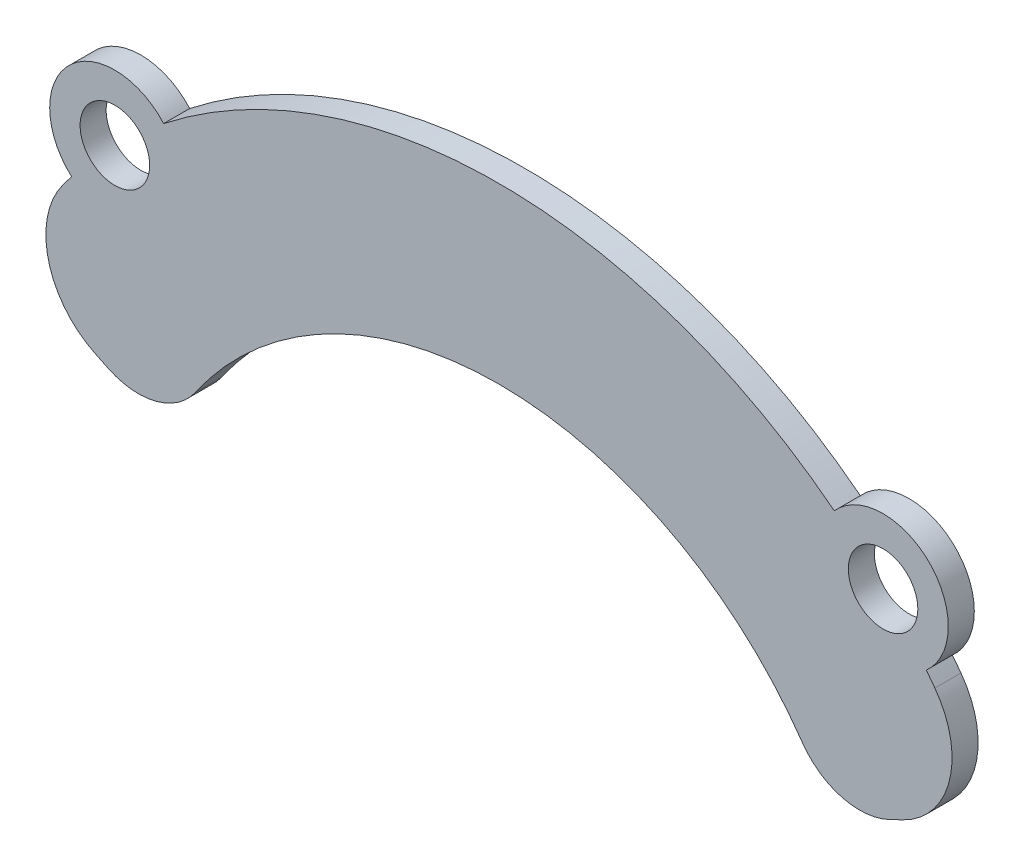
ISO-10303-21;
HEADER;
FILE_DESCRIPTION(('STEP AP214'),'2;1');
FILE_NAME('part.step','',(''),(''),'','','');
FILE_SCHEMA(('AUTOMOTIVE_DESIGN { 1 0 10303 214 1 1 1 1 }'));
ENDSEC;
DATA;
#1=APPLICATION_CONTEXT('core data for automotive mechanical design processes');
#2=APPLICATION_PROTOCOL_DEFINITION('international standard','automotive_design',2000,#1);
#3=PRODUCT_CONTEXT('',#1,'mechanical');
#4=PRODUCT('Part','Part','',(#3));
#5=PRODUCT_RELATED_PRODUCT_CATEGORY('part','',(#4));
#6=PRODUCT_DEFINITION_FORMATION('','',#4);
#7=PRODUCT_DEFINITION_CONTEXT('part definition',#1,'design');
#8=PRODUCT_DEFINITION('design','',#6,#7);
#9=PRODUCT_DEFINITION_SHAPE('','',#8);
#10=(LENGTH_UNIT() NAMED_UNIT(*) SI_UNIT(.MILLI.,.METRE.));
#11=(NAMED_UNIT(*) PLANE_ANGLE_UNIT() SI_UNIT($,.RADIAN.));
#12=(NAMED_UNIT(*) SI_UNIT($,.STERADIAN.) SOLID_ANGLE_UNIT());
#13=UNCERTAINTY_MEASURE_WITH_UNIT(LENGTH_MEASURE(1.E-05),#10,'distance_accuracy_value','');
#14=(GEOMETRIC_REPRESENTATION_CONTEXT(3) GLOBAL_UNCERTAINTY_ASSIGNED_CONTEXT((#13)) GLOBAL_UNIT_ASSIGNED_CONTEXT((#10,
#11,#12)) REPRESENTATION_CONTEXT('',''));
#15=CARTESIAN_POINT('',(0.,0.,0.));
#16=DIRECTION('',(0.,0.,1.));
#17=DIRECTION('',(1.,0.,0.));
#18=AXIS2_PLACEMENT_3D('',#15,#16,#17);
#19=CARTESIAN_POINT('',(0.,-86.8257001430602,6.));
#20=DIRECTION('',(0.,0.,-1.));
#21=DIRECTION('',(-1.,0.,0.));
#22=AXIS2_PLACEMENT_3D('',#19,#20,#21);
#23=CYLINDRICAL_SURFACE('',#22,187.5);
#24=CARTESIAN_POINT('',(0.,-86.8257001430602,-3.));
#25=DIRECTION('',(0.,0.,1.));
#26=DIRECTION('',(1.,0.,0.));
#27=AXIS2_PLACEMENT_3D('',#24,#25,#26);
#28=CIRCLE('',#27,187.5);
#29=CARTESIAN_POINT('',(115.746688386356,60.683466106335,-3.));
#30=VERTEX_POINT('',#29);
#31=CARTESIAN_POINT('',(-115.746688386356,60.683466106335,-3.));
#32=VERTEX_POINT('',#31);
#33=EDGE_CURVE('E167',#30,#32,#28,.T.);
#34=ORIENTED_EDGE('',*,*,#33,.T.);
#35=DIRECTION('',(0.,0.,-1.));
#36=VECTOR('',#35,1.);
#37=CARTESIAN_POINT('',(-115.746688386356,60.683466106335,6.));
#38=LINE('',#37,#36);
#39=CARTESIAN_POINT('',(-115.746688386356,60.683466106335,6.));
#40=VERTEX_POINT('',#39);
#41=EDGE_CURVE('E11',#40,#32,#38,.T.);
#42=ORIENTED_EDGE('',*,*,#41,.F.);
#43=CARTESIAN_POINT('',(0.,-86.8257001430602,6.));
#44=DIRECTION('',(0.,0.,1.));
#45=DIRECTION('',(1.,0.,0.));
#46=AXIS2_PLACEMENT_3D('',#43,#44,#45);
#47=CIRCLE('',#46,187.5);
#48=CARTESIAN_POINT('',(115.746688386356,60.683466106335,6.));
#49=VERTEX_POINT('',#48);
#50=EDGE_CURVE('E114',#49,#40,#47,.T.);
#51=ORIENTED_EDGE('',*,*,#50,.F.);
#52=DIRECTION('',(0.,0.,-1.));
#53=VECTOR('',#52,1.);
#54=CARTESIAN_POINT('',(115.746688386356,60.683466106335,6.));
#55=LINE('',#54,#53);
#56=EDGE_CURVE('E166',#49,#30,#55,.T.);
#57=ORIENTED_EDGE('',*,*,#56,.T.);
#58=EDGE_LOOP('',(#34,#42,#51,#57));
#59=FACE_BOUND('',#58,.T.);
#60=ADVANCED_FACE('F46',(#59),#23,.T.);
#61=CARTESIAN_POINT('',(-132.582521472477,45.7568213294177,6.));
#62=DIRECTION('',(0.,0.,-1.));
#63=DIRECTION('',(-1.,0.,0.));
#64=AXIS2_PLACEMENT_3D('',#61,#62,#63);
#65=CYLINDRICAL_SURFACE('',#64,22.5);
#66=CARTESIAN_POINT('',(-132.582521472477,45.7568213294177,-3.));
#67=DIRECTION('',(0.,0.,1.));
#68=DIRECTION('',(1.,0.,0.));
#69=AXIS2_PLACEMENT_3D('',#66,#67,#68);
#70=CIRCLE('',#69,22.5);
#71=CARTESIAN_POINT('',(-147.509166249395,28.9209882432968,-3.));
#72=VERTEX_POINT('',#71);
#73=EDGE_CURVE('E170',#72,#32,#70,.F.);
#74=ORIENTED_EDGE('',*,*,#73,.F.);
#75=DIRECTION('',(0.,0.,-1.));
#76=VECTOR('',#75,1.);
#77=CARTESIAN_POINT('',(-147.509166249395,28.9209882432968,6.));
#78=LINE('',#77,#76);
#79=CARTESIAN_POINT('',(-147.509166249395,28.9209882432968,6.));
#80=VERTEX_POINT('',#79);
#81=EDGE_CURVE('E55',#80,#72,#78,.T.);
#82=ORIENTED_EDGE('',*,*,#81,.F.);
#83=CARTESIAN_POINT('',(-132.582521472477,45.7568213294177,6.));
#84=DIRECTION('',(0.,0.,1.));
#85=DIRECTION('',(1.,0.,0.));
#86=AXIS2_PLACEMENT_3D('',#83,#84,#85);
#87=CIRCLE('',#86,22.5);
#88=EDGE_CURVE('E225',#80,#40,#87,.F.);
#89=ORIENTED_EDGE('',*,*,#88,.T.);
#90=ORIENTED_EDGE('',*,*,#41,.T.);
#91=EDGE_LOOP('',(#74,#82,#89,#90));
#92=FACE_BOUND('',#91,.T.);
#93=ADVANCED_FACE('F48',(#92),#65,.T.);
#94=CARTESIAN_POINT('',(-150.467856322784,25.0477739856455,-3.));
#95=VERTEX_POINT('',#94);
#96=EDGE_CURVE('E172',#72,#95,#28,.T.);
#97=ORIENTED_EDGE('',*,*,#96,.T.);
#98=DIRECTION('',(0.,0.,-1.));
#99=VECTOR('',#98,1.);
#100=CARTESIAN_POINT('',(-150.467856322784,25.0477739856455,6.));
#101=LINE('',#100,#99);
#102=CARTESIAN_POINT('',(-150.467856322784,25.0477739856455,6.));
#103=VERTEX_POINT('',#102);
#104=EDGE_CURVE('E209',#103,#95,#101,.T.);
#105=ORIENTED_EDGE('',*,*,#104,.F.);
#106=EDGE_CURVE('E216',#80,#103,#47,.T.);
#107=ORIENTED_EDGE('',*,*,#106,.F.);
#108=ORIENTED_EDGE('',*,*,#81,.T.);
#109=EDGE_LOOP('',(#97,#105,#107,#108));
#110=FACE_BOUND('',#109,.T.);
#111=ADVANCED_FACE('F214',(#110),#23,.T.);
#112=CARTESIAN_POINT('',(-126.392999311138,7.14801812505256,6.));
#113=DIRECTION('',(0.,0.,-1.));
#114=DIRECTION('',(-1.,0.,0.));
#115=AXIS2_PLACEMENT_3D('',#112,#113,#114);
#116=CYLINDRICAL_SURFACE('',#115,30.);
#117=CARTESIAN_POINT('',(-126.392999311138,7.14801812505256,-3.));
#118=DIRECTION('',(0.,0.,1.));
#119=DIRECTION('',(1.,0.,0.));
#120=AXIS2_PLACEMENT_3D('',#117,#118,#119);
#121=CIRCLE('',#120,30.);
#122=CARTESIAN_POINT('',(-139.379356091299,-19.8955492723596,-3.));
#123=VERTEX_POINT('',#122);
#124=EDGE_CURVE('E175',#95,#123,#121,.T.);
#125=ORIENTED_EDGE('',*,*,#124,.T.);
#126=DIRECTION('',(0.,0.,-1.));
#127=VECTOR('',#126,1.);
#128=CARTESIAN_POINT('',(-139.379356091299,-19.8955492723596,6.));
#129=LINE('',#128,#127);
#130=CARTESIAN_POINT('',(-139.379356091299,-19.8955492723596,6.));
#131=VERTEX_POINT('',#130);
#132=EDGE_CURVE('E206',#131,#123,#129,.T.);
#133=ORIENTED_EDGE('',*,*,#132,.F.);
#134=CARTESIAN_POINT('',(-126.392999311138,7.14801812505256,6.));
#135=DIRECTION('',(0.,0.,1.));
#136=DIRECTION('',(1.,0.,0.));
#137=AXIS2_PLACEMENT_3D('',#134,#135,#136);
#138=CIRCLE('',#137,30.);
#139=EDGE_CURVE('E256',#103,#131,#138,.T.);
#140=ORIENTED_EDGE('',*,*,#139,.F.);
#141=ORIENTED_EDGE('',*,*,#104,.T.);
#142=EDGE_LOOP('',(#125,#133,#140,#141));
#143=FACE_BOUND('',#142,.T.);
#144=ADVANCED_FACE('F255',(#143),#116,.T.);
#145=CARTESIAN_POINT('',(0.,-86.8257001430602,6.));
#146=DIRECTION('',(0.432878559338705,0.901452246580398,0.));
#147=DIRECTION('',(-0.901452246580398,0.432878559338705,0.));
#148=AXIS2_PLACEMENT_3D('',#145,#146,#147);
#149=PLANE('',#148);
#150=DIRECTION('',(0.901452246580398,-0.432878559338705,0.));
#151=VECTOR('',#150,1.);
#152=CARTESIAN_POINT('',(0.,-86.8257001430602,-3.));
#153=LINE('',#152,#151);
#154=CARTESIAN_POINT('',(-134.845475231993,-22.0727248488085,-3.));
#155=VERTEX_POINT('',#154);
#156=EDGE_CURVE('E177',#123,#155,#153,.T.);
#157=ORIENTED_EDGE('',*,*,#156,.T.);
#158=DIRECTION('',(0.,0.,-1.));
#159=VECTOR('',#158,1.);
#160=CARTESIAN_POINT('',(-134.845475231993,-22.0727248488085,6.));
#161=LINE('',#160,#159);
#162=CARTESIAN_POINT('',(-134.845475231993,-22.0727248488085,6.));
#163=VERTEX_POINT('',#162);
#164=EDGE_CURVE('E204',#163,#155,#161,.T.);
#165=ORIENTED_EDGE('',*,*,#164,.F.);
#166=DIRECTION('',(0.901452246580398,-0.432878559338705,0.));
#167=VECTOR('',#166,1.);
#168=CARTESIAN_POINT('',(0.,-86.8257001430602,6.));
#169=LINE('',#168,#167);
#170=EDGE_CURVE('E252',#131,#163,#169,.T.);
#171=ORIENTED_EDGE('',*,*,#170,.F.);
#172=ORIENTED_EDGE('',*,*,#132,.T.);
#173=EDGE_LOOP('',(#157,#165,#171,#172));
#174=FACE_BOUND('',#173,.T.);
#175=ADVANCED_FACE('F250',(#174),#149,.F.);
#176=CARTESIAN_POINT('',(-124.456389807864,-0.437870930878787,6.));
#177=DIRECTION('',(0.,0.,-1.));
#178=DIRECTION('',(-1.,0.,0.));
#179=AXIS2_PLACEMENT_3D('',#176,#177,#178);
#180=CYLINDRICAL_SURFACE('',#179,24.);
#181=CARTESIAN_POINT('',(-124.456389807864,-0.437870930878787,-3.));
#182=DIRECTION('',(0.,0.,1.));
#183=DIRECTION('',(1.,0.,0.));
#184=AXIS2_PLACEMENT_3D('',#181,#182,#183);
#185=CIRCLE('',#184,24.);
#186=CARTESIAN_POINT('',(-104.740526075925,-14.123071598155,-3.));
#187=VERTEX_POINT('',#186);
#188=EDGE_CURVE('E180',#187,#155,#185,.F.);
#189=ORIENTED_EDGE('',*,*,#188,.F.);
#190=DIRECTION('',(0.,0.,-1.));
#191=VECTOR('',#190,1.);
#192=CARTESIAN_POINT('',(-104.740526075925,-14.123071598155,6.));
#193=LINE('',#192,#191);
#194=CARTESIAN_POINT('',(-104.740526075925,-14.123071598155,6.));
#195=VERTEX_POINT('',#194);
#196=EDGE_CURVE('E202',#195,#187,#193,.T.);
#197=ORIENTED_EDGE('',*,*,#196,.F.);
#198=CARTESIAN_POINT('',(-124.456389807864,-0.437870930878787,6.));
#199=DIRECTION('',(0.,0.,1.));
#200=DIRECTION('',(1.,0.,0.));
#201=AXIS2_PLACEMENT_3D('',#198,#199,#200);
#202=CIRCLE('',#201,24.);
#203=EDGE_CURVE('E247',#195,#163,#202,.F.);
#204=ORIENTED_EDGE('',*,*,#203,.T.);
#205=ORIENTED_EDGE('',*,*,#164,.T.);
#206=EDGE_LOOP('',(#189,#197,#204,#205));
#207=FACE_BOUND('',#206,.T.);
#208=ADVANCED_FACE('F243',(#207),#180,.T.);
#209=CARTESIAN_POINT('',(0.,-86.8257001430602,6.));
#210=DIRECTION('',(0.,0.,-1.));
#211=DIRECTION('',(-1.,0.,0.));
#212=AXIS2_PLACEMENT_3D('',#209,#210,#211);
#213=CYLINDRICAL_SURFACE('',#212,127.5);
#214=CARTESIAN_POINT('',(0.,-86.8257001430602,-3.));
#215=DIRECTION('',(0.,0.,1.));
#216=DIRECTION('',(1.,0.,0.));
#217=AXIS2_PLACEMENT_3D('',#214,#215,#216);
#218=CIRCLE('',#217,127.5);
#219=CARTESIAN_POINT('',(104.740526075925,-14.1230715981551,-3.));
#220=VERTEX_POINT('',#219);
#221=EDGE_CURVE('E183',#220,#187,#218,.T.);
#222=ORIENTED_EDGE('',*,*,#221,.F.);
#223=DIRECTION('',(0.,0.,-1.));
#224=VECTOR('',#223,1.);
#225=CARTESIAN_POINT('',(104.740526075925,-14.1230715981551,6.));
#226=LINE('',#225,#224);
#227=CARTESIAN_POINT('',(104.740526075925,-14.1230715981551,6.));
#228=VERTEX_POINT('',#227);
#229=EDGE_CURVE('E200',#228,#220,#226,.T.);
#230=ORIENTED_EDGE('',*,*,#229,.F.);
#231=CARTESIAN_POINT('',(0.,-86.8257001430602,6.));
#232=DIRECTION('',(0.,0.,1.));
#233=DIRECTION('',(1.,0.,0.));
#234=AXIS2_PLACEMENT_3D('',#231,#232,#233);
#235=CIRCLE('',#234,127.5);
#236=EDGE_CURVE('E240',#228,#195,#235,.T.);
#237=ORIENTED_EDGE('',*,*,#236,.T.);
#238=ORIENTED_EDGE('',*,*,#196,.T.);
#239=EDGE_LOOP('',(#222,#230,#237,#238));
#240=FACE_BOUND('',#239,.T.);
#241=ADVANCED_FACE('F239',(#240),#213,.F.);
#242=CARTESIAN_POINT('',(124.456389807864,-0.437870930878787,6.));
#243=DIRECTION('',(0.,0.,-1.));
#244=DIRECTION('',(-1.,0.,0.));
#245=AXIS2_PLACEMENT_3D('',#242,#243,#244);
#246=CYLINDRICAL_SURFACE('',#245,24.);
#247=CARTESIAN_POINT('',(124.456389807864,-0.437870930878787,-3.));
#248=DIRECTION('',(0.,0.,1.));
#249=DIRECTION('',(1.,0.,0.));
#250=AXIS2_PLACEMENT_3D('',#247,#248,#249);
#251=CIRCLE('',#250,24.);
#252=CARTESIAN_POINT('',(134.845475231993,-22.0727248488085,-3.));
#253=VERTEX_POINT('',#252);
#254=EDGE_CURVE('E186',#220,#253,#251,.T.);
#255=ORIENTED_EDGE('',*,*,#254,.T.);
#256=DIRECTION('',(0.,0.,-1.));
#257=VECTOR('',#256,1.);
#258=CARTESIAN_POINT('',(134.845475231993,-22.0727248488085,6.));
#259=LINE('',#258,#257);
#260=CARTESIAN_POINT('',(134.845475231993,-22.0727248488085,6.));
#261=VERTEX_POINT('',#260);
#262=EDGE_CURVE('E198',#261,#253,#259,.T.);
#263=ORIENTED_EDGE('',*,*,#262,.F.);
#264=CARTESIAN_POINT('',(124.456389807864,-0.437870930878787,6.));
#265=DIRECTION('',(0.,0.,1.));
#266=DIRECTION('',(1.,0.,0.));
#267=AXIS2_PLACEMENT_3D('',#264,#265,#266);
#268=CIRCLE('',#267,24.);
#269=EDGE_CURVE('E161',#228,#261,#268,.T.);
#270=ORIENTED_EDGE('',*,*,#269,.F.);
#271=ORIENTED_EDGE('',*,*,#229,.T.);
#272=EDGE_LOOP('',(#255,#263,#270,#271));
#273=FACE_BOUND('',#272,.T.);
#274=ADVANCED_FACE('F235',(#273),#246,.T.);
#275=CARTESIAN_POINT('',(0.,-86.8257001430602,6.));
#276=DIRECTION('',(0.432878559338705,-0.901452246580398,0.));
#277=DIRECTION('',(0.901452246580398,0.432878559338705,0.));
#278=AXIS2_PLACEMENT_3D('',#275,#276,#277);
#279=PLANE('',#278);
#280=DIRECTION('',(-0.901452246580398,-0.432878559338705,0.));
#281=VECTOR('',#280,1.);
#282=CARTESIAN_POINT('',(0.,-86.8257001430602,-3.));
#283=LINE('',#282,#281);
#284=CARTESIAN_POINT('',(139.379356091299,-19.8955492723596,-3.));
#285=VERTEX_POINT('',#284);
#286=EDGE_CURVE('E189',#285,#253,#283,.T.);
#287=ORIENTED_EDGE('',*,*,#286,.F.);
#288=DIRECTION('',(0.,0.,-1.));
#289=VECTOR('',#288,1.);
#290=CARTESIAN_POINT('',(139.379356091299,-19.8955492723596,6.));
#291=LINE('',#290,#289);
#292=CARTESIAN_POINT('',(139.379356091299,-19.8955492723596,6.));
#293=VERTEX_POINT('',#292);
#294=EDGE_CURVE('E150',#293,#285,#291,.T.);
#295=ORIENTED_EDGE('',*,*,#294,.F.);
#296=DIRECTION('',(-0.901452246580398,-0.432878559338705,0.));
#297=VECTOR('',#296,1.);
#298=CARTESIAN_POINT('',(0.,-86.8257001430602,6.));
#299=LINE('',#298,#297);
#300=EDGE_CURVE('E159',#293,#261,#299,.T.);
#301=ORIENTED_EDGE('',*,*,#300,.T.);
#302=ORIENTED_EDGE('',*,*,#262,.T.);
#303=EDGE_LOOP('',(#287,#295,#301,#302));
#304=FACE_BOUND('',#303,.T.);
#305=ADVANCED_FACE('F231',(#304),#279,.T.);
#306=CARTESIAN_POINT('',(126.392999311138,7.14801812505256,6.));
#307=DIRECTION('',(0.,0.,-1.));
#308=DIRECTION('',(-1.,0.,0.));
#309=AXIS2_PLACEMENT_3D('',#306,#307,#308);
#310=CYLINDRICAL_SURFACE('',#309,30.);
#311=CARTESIAN_POINT('',(126.392999311138,7.14801812505256,-3.));
#312=DIRECTION('',(0.,0.,1.));
#313=DIRECTION('',(1.,0.,0.));
#314=AXIS2_PLACEMENT_3D('',#311,#312,#313);
#315=CIRCLE('',#314,30.);
#316=CARTESIAN_POINT('',(150.467856322784,25.0477739856455,-3.));
#317=VERTEX_POINT('',#316);
#318=EDGE_CURVE('E149',#317,#285,#315,.F.);
#319=ORIENTED_EDGE('',*,*,#318,.F.);
#320=DIRECTION('',(0.,0.,-1.));
#321=VECTOR('',#320,1.);
#322=CARTESIAN_POINT('',(150.467856322784,25.0477739856455,6.));
#323=LINE('',#322,#321);
#324=CARTESIAN_POINT('',(150.467856322784,25.0477739856455,6.));
#325=VERTEX_POINT('',#324);
#326=EDGE_CURVE('E143',#325,#317,#323,.T.);
#327=ORIENTED_EDGE('',*,*,#326,.F.);
#328=CARTESIAN_POINT('',(126.392999311138,7.14801812505256,6.));
#329=DIRECTION('',(0.,0.,1.));
#330=DIRECTION('',(1.,0.,0.));
#331=AXIS2_PLACEMENT_3D('',#328,#329,#330);
#332=CIRCLE('',#331,30.);
#333=EDGE_CURVE('E147',#325,#293,#332,.F.);
#334=ORIENTED_EDGE('',*,*,#333,.T.);
#335=ORIENTED_EDGE('',*,*,#294,.T.);
#336=EDGE_LOOP('',(#319,#327,#334,#335));
#337=FACE_BOUND('',#336,.T.);
#338=ADVANCED_FACE('F145',(#337),#310,.T.);
#339=CARTESIAN_POINT('',(0.,-86.8257001430602,6.));
#340=DIRECTION('',(0.,0.,-1.));
#341=DIRECTION('',(-1.,0.,0.));
#342=AXIS2_PLACEMENT_3D('',#339,#340,#341);
#343=CYLINDRICAL_SURFACE('',#342,187.5);
#344=CARTESIAN_POINT('',(0.,-86.8257001430602,-3.));
#345=DIRECTION('',(0.,0.,1.));
#346=DIRECTION('',(1.,0.,0.));
#347=AXIS2_PLACEMENT_3D('',#344,#345,#346);
#348=CIRCLE('',#347,187.5);
#349=CARTESIAN_POINT('',(147.509166249395,28.9209882432968,-3.));
#350=VERTEX_POINT('',#349);
#351=EDGE_CURVE('E102',#317,#350,#348,.T.);
#352=ORIENTED_EDGE('',*,*,#351,.T.);
#353=DIRECTION('',(0.,0.,-1.));
#354=VECTOR('',#353,1.);
#355=CARTESIAN_POINT('',(147.509166249395,28.9209882432968,6.));
#356=LINE('',#355,#354);
#357=CARTESIAN_POINT('',(147.509166249395,28.9209882432968,6.));
#358=VERTEX_POINT('',#357);
#359=EDGE_CURVE('E151',#358,#350,#356,.T.);
#360=ORIENTED_EDGE('',*,*,#359,.F.);
#361=CARTESIAN_POINT('',(0.,-86.8257001430602,6.));
#362=DIRECTION('',(0.,0.,1.));
#363=DIRECTION('',(1.,0.,0.));
#364=AXIS2_PLACEMENT_3D('',#361,#362,#363);
#365=CIRCLE('',#364,187.5);
#366=EDGE_CURVE('E153',#325,#358,#365,.T.);
#367=ORIENTED_EDGE('',*,*,#366,.F.);
#368=ORIENTED_EDGE('',*,*,#326,.T.);
#369=EDGE_LOOP('',(#352,#360,#367,#368));
#370=FACE_BOUND('',#369,.T.);
#371=ADVANCED_FACE('F154',(#370),#343,.T.);
#372=CARTESIAN_POINT('',(132.582521472477,45.7568213294177,6.));
#373=DIRECTION('',(0.,0.,-1.));
#374=DIRECTION('',(-1.,0.,0.));
#375=AXIS2_PLACEMENT_3D('',#372,#373,#374);
#376=CYLINDRICAL_SURFACE('',#375,22.5);
#377=CARTESIAN_POINT('',(132.582521472477,45.7568213294177,-3.));
#378=DIRECTION('',(0.,0.,1.));
#379=DIRECTION('',(1.,0.,0.));
#380=AXIS2_PLACEMENT_3D('',#377,#378,#379);
#381=CIRCLE('',#380,22.5);
#382=EDGE_CURVE('E108',#350,#30,#381,.T.);
#383=ORIENTED_EDGE('',*,*,#382,.T.);
#384=ORIENTED_EDGE('',*,*,#56,.F.);
#385=CARTESIAN_POINT('',(132.582521472477,45.7568213294177,6.));
#386=DIRECTION('',(0.,0.,1.));
#387=DIRECTION('',(1.,0.,0.));
#388=AXIS2_PLACEMENT_3D('',#385,#386,#387);
#389=CIRCLE('',#388,22.5);
#390=EDGE_CURVE('E63',#358,#49,#389,.T.);
#391=ORIENTED_EDGE('',*,*,#390,.F.);
#392=ORIENTED_EDGE('',*,*,#359,.T.);
#393=EDGE_LOOP('',(#383,#384,#391,#392));
#394=FACE_BOUND('',#393,.T.);
#395=ADVANCED_FACE('F287',(#394),#376,.T.);
#396=CARTESIAN_POINT('',(0.,-86.8257001430602,6.));
#397=DIRECTION('',(0.,0.,1.));
#398=DIRECTION('',(1.,0.,0.));
#399=AXIS2_PLACEMENT_3D('',#396,#397,#398);
#400=PLANE('',#399);
#401=CARTESIAN_POINT('',(-132.582521472477,45.7568213294177,6.));
#402=DIRECTION('',(0.,0.,1.));
#403=DIRECTION('',(1.,0.,0.));
#404=AXIS2_PLACEMENT_3D('',#401,#402,#403);
#405=CIRCLE('',#404,12.);
#406=CARTESIAN_POINT('',(-120.582521472477,45.7568213294177,6.));
#407=VERTEX_POINT('',#406);
#408=EDGE_CURVE('E270',#407,#407,#405,.T.);
#409=ORIENTED_EDGE('',*,*,#408,.F.);
#410=EDGE_LOOP('',(#409));
#411=FACE_BOUND('',#410,.T.);
#412=CARTESIAN_POINT('',(132.582521472477,45.7568213294177,6.));
#413=DIRECTION('',(0.,0.,1.));
#414=DIRECTION('',(1.,0.,0.));
#415=AXIS2_PLACEMENT_3D('',#412,#413,#414);
#416=CIRCLE('',#415,12.);
#417=CARTESIAN_POINT('',(144.582521472477,45.7568213294177,6.));
#418=VERTEX_POINT('',#417);
#419=EDGE_CURVE('E264',#418,#418,#416,.T.);
#420=ORIENTED_EDGE('',*,*,#419,.F.);
#421=EDGE_LOOP('',(#420));
#422=FACE_BOUND('',#421,.T.);
#423=ORIENTED_EDGE('',*,*,#50,.T.);
#424=ORIENTED_EDGE('',*,*,#88,.F.);
#425=ORIENTED_EDGE('',*,*,#106,.T.);
#426=ORIENTED_EDGE('',*,*,#139,.T.);
#427=ORIENTED_EDGE('',*,*,#170,.T.);
#428=ORIENTED_EDGE('',*,*,#203,.F.);
#429=ORIENTED_EDGE('',*,*,#236,.F.);
#430=ORIENTED_EDGE('',*,*,#269,.T.);
#431=ORIENTED_EDGE('',*,*,#300,.F.);
#432=ORIENTED_EDGE('',*,*,#333,.F.);
#433=ORIENTED_EDGE('',*,*,#366,.T.);
#434=ORIENTED_EDGE('',*,*,#390,.T.);
#435=EDGE_LOOP('',(#423,#424,#425,#426,#427,#428,#429,#430,#431,#432,#433,#434));
#436=FACE_BOUND('',#435,.T.);
#437=ADVANCED_FACE('F157',(#411,#422,#436),#400,.T.);
#438=CARTESIAN_POINT('',(0.,-86.8257001430602,-3.));
#439=DIRECTION('',(0.,0.,1.));
#440=DIRECTION('',(1.,0.,0.));
#441=AXIS2_PLACEMENT_3D('',#438,#439,#440);
#442=PLANE('',#441);
#443=CARTESIAN_POINT('',(-132.582521472477,45.7568213294177,-3.));
#444=DIRECTION('',(0.,0.,1.));
#445=DIRECTION('',(1.,0.,0.));
#446=AXIS2_PLACEMENT_3D('',#443,#444,#445);
#447=CIRCLE('',#446,12.);
#448=CARTESIAN_POINT('',(-120.582521472477,45.7568213294177,-3.));
#449=VERTEX_POINT('',#448);
#450=EDGE_CURVE('E171',#449,#449,#447,.T.);
#451=ORIENTED_EDGE('',*,*,#450,.T.);
#452=EDGE_LOOP('',(#451));
#453=FACE_BOUND('',#452,.T.);
#454=CARTESIAN_POINT('',(132.582521472477,45.7568213294177,-3.));
#455=DIRECTION('',(0.,0.,1.));
#456=DIRECTION('',(1.,0.,0.));
#457=AXIS2_PLACEMENT_3D('',#454,#455,#456);
#458=CIRCLE('',#457,12.);
#459=CARTESIAN_POINT('',(144.582521472477,45.7568213294177,-3.));
#460=VERTEX_POINT('',#459);
#461=EDGE_CURVE('E267',#460,#460,#458,.T.);
#462=ORIENTED_EDGE('',*,*,#461,.T.);
#463=EDGE_LOOP('',(#462));
#464=FACE_BOUND('',#463,.T.);
#465=ORIENTED_EDGE('',*,*,#33,.F.);
#466=ORIENTED_EDGE('',*,*,#382,.F.);
#467=ORIENTED_EDGE('',*,*,#351,.F.);
#468=ORIENTED_EDGE('',*,*,#318,.T.);
#469=ORIENTED_EDGE('',*,*,#286,.T.);
#470=ORIENTED_EDGE('',*,*,#254,.F.);
#471=ORIENTED_EDGE('',*,*,#221,.T.);
#472=ORIENTED_EDGE('',*,*,#188,.T.);
#473=ORIENTED_EDGE('',*,*,#156,.F.);
#474=ORIENTED_EDGE('',*,*,#124,.F.);
#475=ORIENTED_EDGE('',*,*,#96,.F.);
#476=ORIENTED_EDGE('',*,*,#73,.T.);
#477=EDGE_LOOP('',(#465,#466,#467,#468,#469,#470,#471,#472,#473,#474,#475,#476));
#478=FACE_BOUND('',#477,.T.);
#479=ADVANCED_FACE('F223',(#453,#464,#478),#442,.F.);
#480=CARTESIAN_POINT('',(132.582521472477,45.7568213294177,-3.));
#481=DIRECTION('',(0.,0.,1.));
#482=DIRECTION('',(1.,0.,0.));
#483=AXIS2_PLACEMENT_3D('',#480,#481,#482);
#484=CYLINDRICAL_SURFACE('',#483,12.);
#485=ORIENTED_EDGE('',*,*,#461,.F.);
#486=EDGE_LOOP('',(#485));
#487=FACE_BOUND('',#486,.T.);
#488=ORIENTED_EDGE('',*,*,#419,.T.);
#489=EDGE_LOOP('',(#488));
#490=FACE_BOUND('',#489,.T.);
#491=ADVANCED_FACE('F281',(#487,#490),#484,.F.);
#492=CARTESIAN_POINT('',(-132.582521472477,45.7568213294177,-3.));
#493=DIRECTION('',(0.,0.,1.));
#494=DIRECTION('',(1.,0.,0.));
#495=AXIS2_PLACEMENT_3D('',#492,#493,#494);
#496=CYLINDRICAL_SURFACE('',#495,12.);
#497=ORIENTED_EDGE('',*,*,#450,.F.);
#498=EDGE_LOOP('',(#497));
#499=FACE_BOUND('',#498,.T.);
#500=ORIENTED_EDGE('',*,*,#408,.T.);
#501=EDGE_LOOP('',(#500));
#502=FACE_BOUND('',#501,.T.);
#503=ADVANCED_FACE('F278',(#499,#502),#496,.F.);
#504=CLOSED_SHELL('',(#60,#93,#111,#144,#175,#208,#241,#274,#305,#338,#371,#395,#437,#479,#491,#503));
#505=MANIFOLD_SOLID_BREP('B2',#504);
#506=ADVANCED_BREP_SHAPE_REPRESENTATION('',(#18,#505),#14);
#507=SHAPE_DEFINITION_REPRESENTATION(#9,#506);
ENDSEC;
END-ISO-10303-21;
